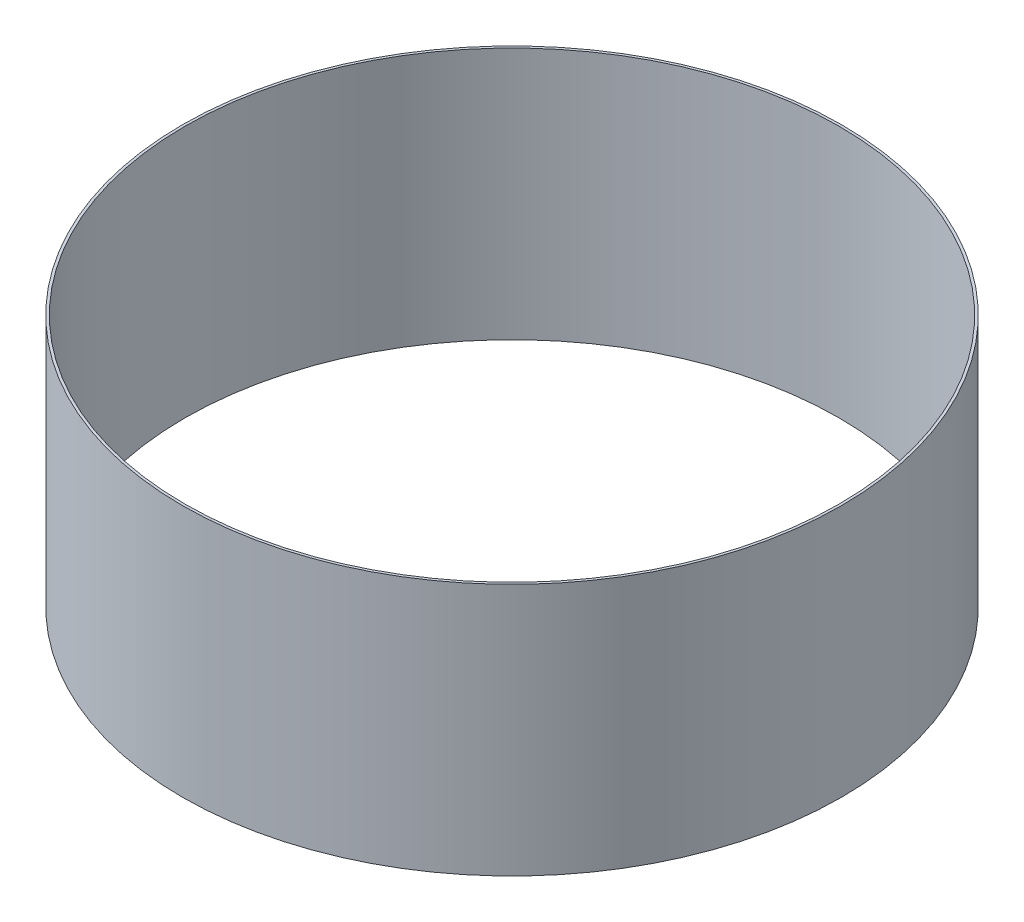
ISO-10303-21;
HEADER;
FILE_DESCRIPTION(('STEP AP214'),'2;1');
FILE_NAME('part.step','',(''),(''),'','','');
FILE_SCHEMA(('AUTOMOTIVE_DESIGN { 1 0 10303 214 1 1 1 1 }'));
ENDSEC;
DATA;
#1=APPLICATION_CONTEXT('core data for automotive mechanical design processes');
#2=APPLICATION_PROTOCOL_DEFINITION('international standard','automotive_design',2000,#1);
#3=PRODUCT_CONTEXT('',#1,'mechanical');
#4=PRODUCT('Part','Part','',(#3));
#5=PRODUCT_RELATED_PRODUCT_CATEGORY('part','',(#4));
#6=PRODUCT_DEFINITION_FORMATION('','',#4);
#7=PRODUCT_DEFINITION_CONTEXT('part definition',#1,'design');
#8=PRODUCT_DEFINITION('design','',#6,#7);
#9=PRODUCT_DEFINITION_SHAPE('','',#8);
#10=(LENGTH_UNIT() NAMED_UNIT(*) SI_UNIT(.MILLI.,.METRE.));
#11=(NAMED_UNIT(*) PLANE_ANGLE_UNIT() SI_UNIT($,.RADIAN.));
#12=(NAMED_UNIT(*) SI_UNIT($,.STERADIAN.) SOLID_ANGLE_UNIT());
#13=UNCERTAINTY_MEASURE_WITH_UNIT(LENGTH_MEASURE(1.E-05),#10,'distance_accuracy_value','');
#14=(GEOMETRIC_REPRESENTATION_CONTEXT(3) GLOBAL_UNCERTAINTY_ASSIGNED_CONTEXT((#13)) GLOBAL_UNIT_ASSIGNED_CONTEXT((#10,
#11,#12)) REPRESENTATION_CONTEXT('',''));
#15=CARTESIAN_POINT('',(0.,0.,0.));
#16=DIRECTION('',(0.,0.,1.));
#17=DIRECTION('',(1.,0.,0.));
#18=AXIS2_PLACEMENT_3D('',#15,#16,#17);
#19=CARTESIAN_POINT('',(0.,25.,0.));
#20=DIRECTION('',(0.,1.,0.));
#21=DIRECTION('',(0.,0.,1.));
#22=AXIS2_PLACEMENT_3D('',#19,#20,#21);
#23=PLANE('',#22);
#24=CARTESIAN_POINT('',(0.,25.,0.));
#25=DIRECTION('',(0.,1.,0.));
#26=DIRECTION('',(0.,0.,1.));
#27=AXIS2_PLACEMENT_3D('',#24,#25,#26);
#28=CIRCLE('',#27,32.625);
#29=CARTESIAN_POINT('',(0.,25.,32.625));
#30=VERTEX_POINT('',#29);
#31=EDGE_CURVE('E10',#30,#30,#28,.T.);
#32=ORIENTED_EDGE('',*,*,#31,.T.);
#33=EDGE_LOOP('',(#32));
#34=FACE_BOUND('',#33,.T.);
#35=CARTESIAN_POINT('',(0.,25.,0.));
#36=DIRECTION('',(0.,1.,0.));
#37=DIRECTION('',(0.,0.,1.));
#38=AXIS2_PLACEMENT_3D('',#35,#36,#37);
#39=CIRCLE('',#38,32.375);
#40=CARTESIAN_POINT('',(0.,25.,32.375));
#41=VERTEX_POINT('',#40);
#42=EDGE_CURVE('E41',#41,#41,#39,.T.);
#43=ORIENTED_EDGE('',*,*,#42,.F.);
#44=EDGE_LOOP('',(#43));
#45=FACE_BOUND('',#44,.T.);
#46=ADVANCED_FACE('F30',(#34,#45),#23,.T.);
#47=CARTESIAN_POINT('',(0.,0.,0.));
#48=DIRECTION('',(0.,1.,0.));
#49=DIRECTION('',(0.,0.,1.));
#50=AXIS2_PLACEMENT_3D('',#47,#48,#49);
#51=PLANE('',#50);
#52=CARTESIAN_POINT('',(0.,0.,0.));
#53=DIRECTION('',(0.,1.,0.));
#54=DIRECTION('',(0.,0.,1.));
#55=AXIS2_PLACEMENT_3D('',#52,#53,#54);
#56=CIRCLE('',#55,32.625);
#57=CARTESIAN_POINT('',(0.,0.,32.625));
#58=VERTEX_POINT('',#57);
#59=EDGE_CURVE('E34',#58,#58,#56,.T.);
#60=ORIENTED_EDGE('',*,*,#59,.F.);
#61=EDGE_LOOP('',(#60));
#62=FACE_BOUND('',#61,.T.);
#63=CARTESIAN_POINT('',(0.,0.,0.));
#64=DIRECTION('',(0.,1.,0.));
#65=DIRECTION('',(0.,0.,1.));
#66=AXIS2_PLACEMENT_3D('',#63,#64,#65);
#67=CIRCLE('',#66,32.375);
#68=CARTESIAN_POINT('',(0.,0.,32.375));
#69=VERTEX_POINT('',#68);
#70=EDGE_CURVE('E43',#69,#69,#67,.T.);
#71=ORIENTED_EDGE('',*,*,#70,.T.);
#72=EDGE_LOOP('',(#71));
#73=FACE_BOUND('',#72,.T.);
#74=ADVANCED_FACE('F53',(#62,#73),#51,.F.);
#75=CARTESIAN_POINT('',(0.,25.,0.));
#76=DIRECTION('',(0.,-1.,0.));
#77=DIRECTION('',(0.,0.,-1.));
#78=AXIS2_PLACEMENT_3D('',#75,#76,#77);
#79=CYLINDRICAL_SURFACE('',#78,32.625);
#80=ORIENTED_EDGE('',*,*,#31,.F.);
#81=EDGE_LOOP('',(#80));
#82=FACE_BOUND('',#81,.T.);
#83=ORIENTED_EDGE('',*,*,#59,.T.);
#84=EDGE_LOOP('',(#83));
#85=FACE_BOUND('',#84,.T.);
#86=ADVANCED_FACE('F32',(#82,#85),#79,.T.);
#87=CARTESIAN_POINT('',(0.,25.,0.));
#88=DIRECTION('',(0.,-1.,0.));
#89=DIRECTION('',(0.,0.,-1.));
#90=AXIS2_PLACEMENT_3D('',#87,#88,#89);
#91=CYLINDRICAL_SURFACE('',#90,32.375);
#92=ORIENTED_EDGE('',*,*,#42,.T.);
#93=EDGE_LOOP('',(#92));
#94=FACE_BOUND('',#93,.T.);
#95=ORIENTED_EDGE('',*,*,#70,.F.);
#96=EDGE_LOOP('',(#95));
#97=FACE_BOUND('',#96,.T.);
#98=ADVANCED_FACE('F49',(#94,#97),#91,.F.);
#99=CLOSED_SHELL('',(#46,#74,#86,#98));
#100=MANIFOLD_SOLID_BREP('B2',#99);
#101=ADVANCED_BREP_SHAPE_REPRESENTATION('',(#18,#100),#14);
#102=SHAPE_DEFINITION_REPRESENTATION(#9,#101);
ENDSEC;
END-ISO-10303-21;
